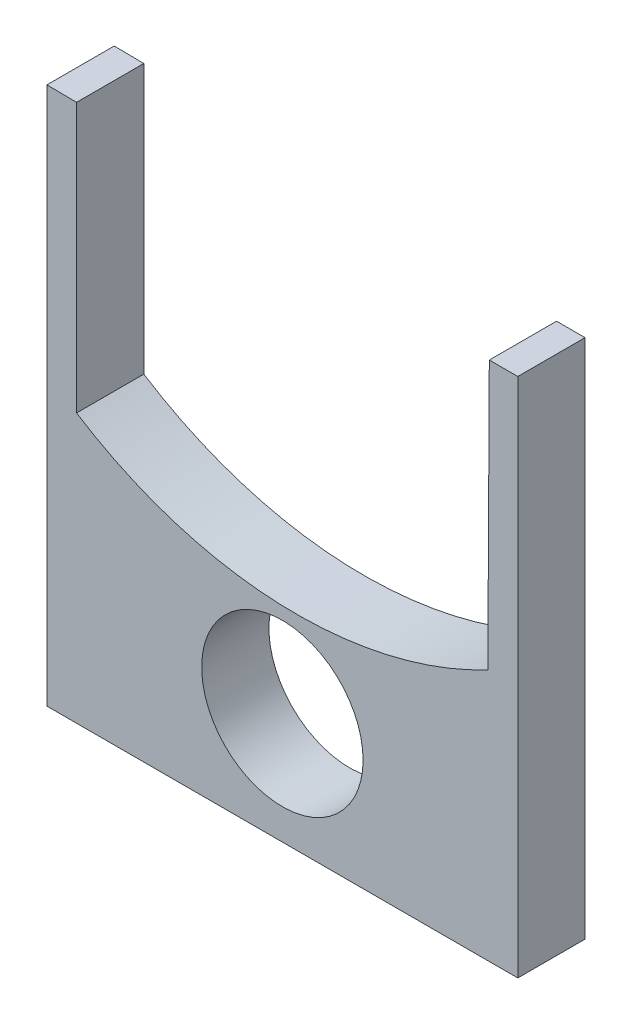
ISO-10303-21;
HEADER;
FILE_DESCRIPTION(('STEP AP214'),'2;1');
FILE_NAME('part.step','',(''),(''),'','','');
FILE_SCHEMA(('AUTOMOTIVE_DESIGN { 1 0 10303 214 1 1 1 1 }'));
ENDSEC;
DATA;
#1=APPLICATION_CONTEXT('core data for automotive mechanical design processes');
#2=APPLICATION_PROTOCOL_DEFINITION('international standard','automotive_design',2000,#1);
#3=PRODUCT_CONTEXT('',#1,'mechanical');
#4=PRODUCT('Part','Part','',(#3));
#5=PRODUCT_RELATED_PRODUCT_CATEGORY('part','',(#4));
#6=PRODUCT_DEFINITION_FORMATION('','',#4);
#7=PRODUCT_DEFINITION_CONTEXT('part definition',#1,'design');
#8=PRODUCT_DEFINITION('design','',#6,#7);
#9=PRODUCT_DEFINITION_SHAPE('','',#8);
#10=(LENGTH_UNIT() NAMED_UNIT(*) SI_UNIT(.MILLI.,.METRE.));
#11=(NAMED_UNIT(*) PLANE_ANGLE_UNIT() SI_UNIT($,.RADIAN.));
#12=(NAMED_UNIT(*) SI_UNIT($,.STERADIAN.) SOLID_ANGLE_UNIT());
#13=UNCERTAINTY_MEASURE_WITH_UNIT(LENGTH_MEASURE(1.E-05),#10,'distance_accuracy_value','');
#14=(GEOMETRIC_REPRESENTATION_CONTEXT(3) GLOBAL_UNCERTAINTY_ASSIGNED_CONTEXT((#13)) GLOBAL_UNIT_ASSIGNED_CONTEXT((#10,
#11,#12)) REPRESENTATION_CONTEXT('',''));
#15=CARTESIAN_POINT('',(0.,0.,0.));
#16=DIRECTION('',(0.,0.,1.));
#17=DIRECTION('',(1.,0.,0.));
#18=AXIS2_PLACEMENT_3D('',#15,#16,#17);
#19=CARTESIAN_POINT('',(1.0586356545803,19.5319103845427,5.));
#20=DIRECTION('',(0.,0.,-1.));
#21=DIRECTION('',(-1.,0.,0.));
#22=AXIS2_PLACEMENT_3D('',#19,#20,#21);
#23=PLANE('',#22);
#24=DIRECTION('',(-0.00549442255794869,-0.999984905546456,0.));
#25=VECTOR('',#24,1.);
#26=CARTESIAN_POINT('',(15.3824163383692,12.6612044888398,5.));
#27=LINE('',#26,#25);
#28=CARTESIAN_POINT('',(15.3824163383692,12.6612044888398,5.));
#29=VERTEX_POINT('',#28);
#30=CARTESIAN_POINT('',(15.2725278872103,-7.33849362208936,5.));
#31=VERTEX_POINT('',#30);
#32=EDGE_CURVE('E145',#29,#31,#27,.T.);
#33=ORIENTED_EDGE('',*,*,#32,.T.);
#34=CARTESIAN_POINT('',(1.0586356545803,19.5319103845427,5.));
#35=DIRECTION('',(0.,0.,-1.));
#36=DIRECTION('',(-1.,0.,0.));
#37=AXIS2_PLACEMENT_3D('',#34,#35,#36);
#38=CIRCLE('',#37,30.3982457368915);
#39=CARTESIAN_POINT('',(-15.3001453152351,-6.08924550394231,5.));
#40=VERTEX_POINT('',#39);
#41=EDGE_CURVE('E93',#31,#40,#38,.T.);
#42=ORIENTED_EDGE('',*,*,#41,.T.);
#43=DIRECTION('',(0.,1.,0.));
#44=VECTOR('',#43,1.);
#45=CARTESIAN_POINT('',(-15.3001453152351,13.9107544960577,5.));
#46=LINE('',#45,#44);
#47=CARTESIAN_POINT('',(-15.3001453152351,13.9107544960577,5.));
#48=VERTEX_POINT('',#47);
#49=EDGE_CURVE('E160',#40,#48,#46,.T.);
#50=ORIENTED_EDGE('',*,*,#49,.T.);
#51=DIRECTION('',(-0.999933947620391,0.0114934936508106,0.));
#52=VECTOR('',#51,1.);
#53=CARTESIAN_POINT('',(-17.5,13.9360401820895,5.));
#54=LINE('',#53,#52);
#55=CARTESIAN_POINT('',(-17.5,13.9360401820895,5.));
#56=VERTEX_POINT('',#55);
#57=EDGE_CURVE('E173',#48,#56,#54,.T.);
#58=ORIENTED_EDGE('',*,*,#57,.T.);
#59=DIRECTION('',(0.,-1.,0.));
#60=VECTOR('',#59,1.);
#61=CARTESIAN_POINT('',(-17.5,-26.0639598179105,5.));
#62=LINE('',#61,#60);
#63=CARTESIAN_POINT('',(-17.5,-26.0639598179105,5.));
#64=VERTEX_POINT('',#63);
#65=EDGE_CURVE('E112',#56,#64,#62,.T.);
#66=ORIENTED_EDGE('',*,*,#65,.T.);
#67=DIRECTION('',(1.,0.,0.));
#68=VECTOR('',#67,1.);
#69=CARTESIAN_POINT('',(17.5,-26.0639598179105,5.));
#70=LINE('',#69,#68);
#71=CARTESIAN_POINT('',(17.5,-26.0639598179105,5.));
#72=VERTEX_POINT('',#71);
#73=EDGE_CURVE('E106',#64,#72,#70,.T.);
#74=ORIENTED_EDGE('',*,*,#73,.T.);
#75=DIRECTION('',(0.,1.,0.));
#76=VECTOR('',#75,1.);
#77=CARTESIAN_POINT('',(17.5,-26.0639598179105,5.));
#78=LINE('',#77,#76);
#79=CARTESIAN_POINT('',(17.5,12.6612044888398,5.));
#80=VERTEX_POINT('',#79);
#81=EDGE_CURVE('E110',#72,#80,#78,.T.);
#82=ORIENTED_EDGE('',*,*,#81,.T.);
#83=DIRECTION('',(-1.,0.,0.));
#84=VECTOR('',#83,1.);
#85=CARTESIAN_POINT('',(17.5,12.6612044888398,5.));
#86=LINE('',#85,#84);
#87=EDGE_CURVE('E50',#80,#29,#86,.T.);
#88=ORIENTED_EDGE('',*,*,#87,.T.);
#89=EDGE_LOOP('',(#33,#42,#50,#58,#66,#74,#82,#88));
#90=FACE_BOUND('',#89,.T.);
#91=CARTESIAN_POINT('',(0.,-17.7864885004553,5.));
#92=DIRECTION('',(0.,0.,1.));
#93=DIRECTION('',(1.,0.,0.));
#94=AXIS2_PLACEMENT_3D('',#91,#92,#93);
#95=CIRCLE('',#94,6.);
#96=CARTESIAN_POINT('',(6.,-17.7864885004553,5.));
#97=VERTEX_POINT('',#96);
#98=EDGE_CURVE('E134',#97,#97,#95,.T.);
#99=ORIENTED_EDGE('',*,*,#98,.F.);
#100=EDGE_LOOP('',(#99));
#101=FACE_BOUND('',#100,.T.);
#102=ADVANCED_FACE('F33',(#90,#101),#23,.F.);
#103=CARTESIAN_POINT('',(1.0586356545803,19.5319103845427,0.));
#104=DIRECTION('',(0.,0.,-1.));
#105=DIRECTION('',(-1.,0.,0.));
#106=AXIS2_PLACEMENT_3D('',#103,#104,#105);
#107=PLANE('',#106);
#108=DIRECTION('',(-0.00549442255794869,-0.999984905546456,0.));
#109=VECTOR('',#108,1.);
#110=CARTESIAN_POINT('',(15.3824163383692,12.6612044888398,0.));
#111=LINE('',#110,#109);
#112=CARTESIAN_POINT('',(15.3824163383692,12.6612044888398,0.));
#113=VERTEX_POINT('',#112);
#114=CARTESIAN_POINT('',(15.2725278872103,-7.33849362208936,0.));
#115=VERTEX_POINT('',#114);
#116=EDGE_CURVE('E130',#113,#115,#111,.T.);
#117=ORIENTED_EDGE('',*,*,#116,.F.);
#118=DIRECTION('',(-1.,0.,0.));
#119=VECTOR('',#118,1.);
#120=CARTESIAN_POINT('',(17.5,12.6612044888398,0.));
#121=LINE('',#120,#119);
#122=CARTESIAN_POINT('',(17.5,12.6612044888398,0.));
#123=VERTEX_POINT('',#122);
#124=EDGE_CURVE('E85',#123,#113,#121,.T.);
#125=ORIENTED_EDGE('',*,*,#124,.F.);
#126=DIRECTION('',(0.,1.,0.));
#127=VECTOR('',#126,1.);
#128=CARTESIAN_POINT('',(17.5,-26.0639598179105,0.));
#129=LINE('',#128,#127);
#130=CARTESIAN_POINT('',(17.5,-26.0639598179105,0.));
#131=VERTEX_POINT('',#130);
#132=EDGE_CURVE('E79',#131,#123,#129,.T.);
#133=ORIENTED_EDGE('',*,*,#132,.F.);
#134=DIRECTION('',(1.,0.,0.));
#135=VECTOR('',#134,1.);
#136=CARTESIAN_POINT('',(17.5,-26.0639598179105,0.));
#137=LINE('',#136,#135);
#138=CARTESIAN_POINT('',(-17.5,-26.0639598179105,0.));
#139=VERTEX_POINT('',#138);
#140=EDGE_CURVE('E120',#139,#131,#137,.T.);
#141=ORIENTED_EDGE('',*,*,#140,.F.);
#142=DIRECTION('',(0.,-1.,0.));
#143=VECTOR('',#142,1.);
#144=CARTESIAN_POINT('',(-17.5,-26.0639598179105,0.));
#145=LINE('',#144,#143);
#146=CARTESIAN_POINT('',(-17.5,13.9360401820895,0.));
#147=VERTEX_POINT('',#146);
#148=EDGE_CURVE('E140',#147,#139,#145,.T.);
#149=ORIENTED_EDGE('',*,*,#148,.F.);
#150=DIRECTION('',(-0.999933947620391,0.0114934936508106,0.));
#151=VECTOR('',#150,1.);
#152=CARTESIAN_POINT('',(-17.5,13.9360401820895,0.));
#153=LINE('',#152,#151);
#154=CARTESIAN_POINT('',(-15.3001453152351,13.9107544960577,0.));
#155=VERTEX_POINT('',#154);
#156=EDGE_CURVE('E138',#155,#147,#153,.T.);
#157=ORIENTED_EDGE('',*,*,#156,.F.);
#158=DIRECTION('',(0.,1.,0.));
#159=VECTOR('',#158,1.);
#160=CARTESIAN_POINT('',(-15.3001453152351,13.9107544960577,0.));
#161=LINE('',#160,#159);
#162=CARTESIAN_POINT('',(-15.3001453152351,-6.08924550394231,0.));
#163=VERTEX_POINT('',#162);
#164=EDGE_CURVE('E136',#163,#155,#161,.T.);
#165=ORIENTED_EDGE('',*,*,#164,.F.);
#166=CARTESIAN_POINT('',(1.0586356545803,19.5319103845427,0.));
#167=DIRECTION('',(0.,0.,-1.));
#168=DIRECTION('',(-1.,0.,0.));
#169=AXIS2_PLACEMENT_3D('',#166,#167,#168);
#170=CIRCLE('',#169,30.3982457368915);
#171=EDGE_CURVE('E133',#115,#163,#170,.T.);
#172=ORIENTED_EDGE('',*,*,#171,.F.);
#173=EDGE_LOOP('',(#117,#125,#133,#141,#149,#157,#165,#172));
#174=FACE_BOUND('',#173,.T.);
#175=CARTESIAN_POINT('',(0.,-17.7864885004553,0.));
#176=DIRECTION('',(0.,0.,1.));
#177=DIRECTION('',(1.,0.,0.));
#178=AXIS2_PLACEMENT_3D('',#175,#176,#177);
#179=CIRCLE('',#178,6.);
#180=CARTESIAN_POINT('',(6.,-17.7864885004553,0.));
#181=VERTEX_POINT('',#180);
#182=EDGE_CURVE('E179',#181,#181,#179,.T.);
#183=ORIENTED_EDGE('',*,*,#182,.T.);
#184=EDGE_LOOP('',(#183));
#185=FACE_BOUND('',#184,.T.);
#186=ADVANCED_FACE('F164',(#174,#185),#107,.T.);
#187=CARTESIAN_POINT('',(15.3824163383692,12.6612044888398,5.));
#188=DIRECTION('',(0.999984905546456,-0.00549442255794869,0.));
#189=DIRECTION('',(0.00549442255794869,0.999984905546456,0.));
#190=AXIS2_PLACEMENT_3D('',#187,#188,#189);
#191=PLANE('',#190);
#192=ORIENTED_EDGE('',*,*,#116,.T.);
#193=DIRECTION('',(0.,0.,-1.));
#194=VECTOR('',#193,1.);
#195=CARTESIAN_POINT('',(15.2725278872103,-7.33849362208936,5.));
#196=LINE('',#195,#194);
#197=EDGE_CURVE('E11',#31,#115,#196,.T.);
#198=ORIENTED_EDGE('',*,*,#197,.F.);
#199=ORIENTED_EDGE('',*,*,#32,.F.);
#200=DIRECTION('',(0.,0.,-1.));
#201=VECTOR('',#200,1.);
#202=CARTESIAN_POINT('',(15.3824163383692,12.6612044888398,5.));
#203=LINE('',#202,#201);
#204=EDGE_CURVE('E126',#29,#113,#203,.T.);
#205=ORIENTED_EDGE('',*,*,#204,.T.);
#206=EDGE_LOOP('',(#192,#198,#199,#205));
#207=FACE_BOUND('',#206,.T.);
#208=ADVANCED_FACE('F35',(#207),#191,.F.);
#209=CARTESIAN_POINT('',(1.0586356545803,19.5319103845427,5.));
#210=DIRECTION('',(0.,0.,-1.));
#211=DIRECTION('',(-1.,0.,0.));
#212=AXIS2_PLACEMENT_3D('',#209,#210,#211);
#213=CYLINDRICAL_SURFACE('',#212,30.3982457368915);
#214=ORIENTED_EDGE('',*,*,#171,.T.);
#215=DIRECTION('',(0.,0.,-1.));
#216=VECTOR('',#215,1.);
#217=CARTESIAN_POINT('',(-15.3001453152351,-6.08924550394231,5.));
#218=LINE('',#217,#216);
#219=EDGE_CURVE('E42',#40,#163,#218,.T.);
#220=ORIENTED_EDGE('',*,*,#219,.F.);
#221=ORIENTED_EDGE('',*,*,#41,.F.);
#222=ORIENTED_EDGE('',*,*,#197,.T.);
#223=EDGE_LOOP('',(#214,#220,#221,#222));
#224=FACE_BOUND('',#223,.T.);
#225=ADVANCED_FACE('F207',(#224),#213,.F.);
#226=CARTESIAN_POINT('',(-15.3001453152351,13.9107544960577,5.));
#227=DIRECTION('',(-1.,0.,0.));
#228=DIRECTION('',(0.,0.,1.));
#229=AXIS2_PLACEMENT_3D('',#226,#227,#228);
#230=PLANE('',#229);
#231=ORIENTED_EDGE('',*,*,#164,.T.);
#232=DIRECTION('',(0.,0.,-1.));
#233=VECTOR('',#232,1.);
#234=CARTESIAN_POINT('',(-15.3001453152351,13.9107544960577,5.));
#235=LINE('',#234,#233);
#236=EDGE_CURVE('E152',#48,#155,#235,.T.);
#237=ORIENTED_EDGE('',*,*,#236,.F.);
#238=ORIENTED_EDGE('',*,*,#49,.F.);
#239=ORIENTED_EDGE('',*,*,#219,.T.);
#240=EDGE_LOOP('',(#231,#237,#238,#239));
#241=FACE_BOUND('',#240,.T.);
#242=ADVANCED_FACE('F158',(#241),#230,.F.);
#243=CARTESIAN_POINT('',(-17.5,13.9360401820895,5.));
#244=DIRECTION('',(-0.0114934936508106,-0.999933947620391,0.));
#245=DIRECTION('',(0.999933947620391,-0.0114934936508106,0.));
#246=AXIS2_PLACEMENT_3D('',#243,#244,#245);
#247=PLANE('',#246);
#248=ORIENTED_EDGE('',*,*,#156,.T.);
#249=DIRECTION('',(0.,0.,-1.));
#250=VECTOR('',#249,1.);
#251=CARTESIAN_POINT('',(-17.5,13.9360401820895,5.));
#252=LINE('',#251,#250);
#253=EDGE_CURVE('E149',#56,#147,#252,.T.);
#254=ORIENTED_EDGE('',*,*,#253,.F.);
#255=ORIENTED_EDGE('',*,*,#57,.F.);
#256=ORIENTED_EDGE('',*,*,#236,.T.);
#257=EDGE_LOOP('',(#248,#254,#255,#256));
#258=FACE_BOUND('',#257,.T.);
#259=ADVANCED_FACE('F169',(#258),#247,.F.);
#260=CARTESIAN_POINT('',(-17.5,-26.0639598179105,5.));
#261=DIRECTION('',(1.,0.,0.));
#262=DIRECTION('',(0.,0.,-1.));
#263=AXIS2_PLACEMENT_3D('',#260,#261,#262);
#264=PLANE('',#263);
#265=ORIENTED_EDGE('',*,*,#148,.T.);
#266=DIRECTION('',(0.,0.,-1.));
#267=VECTOR('',#266,1.);
#268=CARTESIAN_POINT('',(-17.5,-26.0639598179105,5.));
#269=LINE('',#268,#267);
#270=EDGE_CURVE('E121',#64,#139,#269,.T.);
#271=ORIENTED_EDGE('',*,*,#270,.F.);
#272=ORIENTED_EDGE('',*,*,#65,.F.);
#273=ORIENTED_EDGE('',*,*,#253,.T.);
#274=EDGE_LOOP('',(#265,#271,#272,#273));
#275=FACE_BOUND('',#274,.T.);
#276=ADVANCED_FACE('F172',(#275),#264,.F.);
#277=CARTESIAN_POINT('',(17.5,-26.0639598179105,5.));
#278=DIRECTION('',(0.,1.,0.));
#279=DIRECTION('',(0.,0.,1.));
#280=AXIS2_PLACEMENT_3D('',#277,#278,#279);
#281=PLANE('',#280);
#282=ORIENTED_EDGE('',*,*,#140,.T.);
#283=DIRECTION('',(0.,0.,-1.));
#284=VECTOR('',#283,1.);
#285=CARTESIAN_POINT('',(17.5,-26.0639598179105,5.));
#286=LINE('',#285,#284);
#287=EDGE_CURVE('E117',#72,#131,#286,.T.);
#288=ORIENTED_EDGE('',*,*,#287,.F.);
#289=ORIENTED_EDGE('',*,*,#73,.F.);
#290=ORIENTED_EDGE('',*,*,#270,.T.);
#291=EDGE_LOOP('',(#282,#288,#289,#290));
#292=FACE_BOUND('',#291,.T.);
#293=ADVANCED_FACE('F118',(#292),#281,.F.);
#294=CARTESIAN_POINT('',(17.5,-26.0639598179105,5.));
#295=DIRECTION('',(-1.,0.,0.));
#296=DIRECTION('',(0.,0.,1.));
#297=AXIS2_PLACEMENT_3D('',#294,#295,#296);
#298=PLANE('',#297);
#299=ORIENTED_EDGE('',*,*,#132,.T.);
#300=DIRECTION('',(0.,0.,-1.));
#301=VECTOR('',#300,1.);
#302=CARTESIAN_POINT('',(17.5,12.6612044888398,5.));
#303=LINE('',#302,#301);
#304=EDGE_CURVE('E122',#80,#123,#303,.T.);
#305=ORIENTED_EDGE('',*,*,#304,.F.);
#306=ORIENTED_EDGE('',*,*,#81,.F.);
#307=ORIENTED_EDGE('',*,*,#287,.T.);
#308=EDGE_LOOP('',(#299,#305,#306,#307));
#309=FACE_BOUND('',#308,.T.);
#310=ADVANCED_FACE('F124',(#309),#298,.F.);
#311=CARTESIAN_POINT('',(17.5,12.6612044888398,5.));
#312=DIRECTION('',(0.,-1.,0.));
#313=DIRECTION('',(0.,0.,-1.));
#314=AXIS2_PLACEMENT_3D('',#311,#312,#313);
#315=PLANE('',#314);
#316=ORIENTED_EDGE('',*,*,#124,.T.);
#317=ORIENTED_EDGE('',*,*,#204,.F.);
#318=ORIENTED_EDGE('',*,*,#87,.F.);
#319=ORIENTED_EDGE('',*,*,#304,.T.);
#320=EDGE_LOOP('',(#316,#317,#318,#319));
#321=FACE_BOUND('',#320,.T.);
#322=ADVANCED_FACE('F195',(#321),#315,.F.);
#323=CARTESIAN_POINT('',(0.,-17.7864885004553,5.));
#324=DIRECTION('',(0.,0.,-1.));
#325=DIRECTION('',(-1.,0.,0.));
#326=AXIS2_PLACEMENT_3D('',#323,#324,#325);
#327=CYLINDRICAL_SURFACE('',#326,6.);
#328=ORIENTED_EDGE('',*,*,#98,.T.);
#329=EDGE_LOOP('',(#328));
#330=FACE_BOUND('',#329,.T.);
#331=ORIENTED_EDGE('',*,*,#182,.F.);
#332=EDGE_LOOP('',(#331));
#333=FACE_BOUND('',#332,.T.);
#334=ADVANCED_FACE('F185',(#330,#333),#327,.F.);
#335=CLOSED_SHELL('',(#102,#186,#208,#225,#242,#259,#276,#293,#310,#322,#334));
#336=MANIFOLD_SOLID_BREP('B2',#335);
#337=ADVANCED_BREP_SHAPE_REPRESENTATION('',(#18,#336),#14);
#338=SHAPE_DEFINITION_REPRESENTATION(#9,#337);
ENDSEC;
END-ISO-10303-21;
